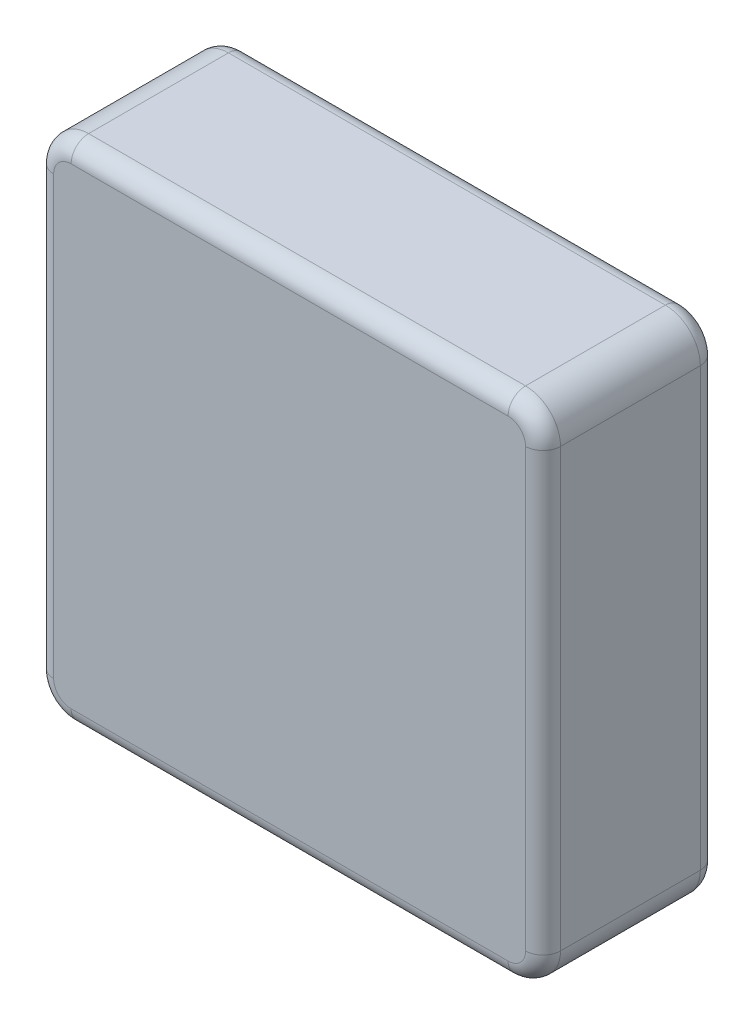
ISO-10303-21;
HEADER;
FILE_DESCRIPTION(('STEP AP214'),'2;1');
FILE_NAME('part.step','',(''),(''),'','','');
FILE_SCHEMA(('AUTOMOTIVE_DESIGN { 1 0 10303 214 1 1 1 1 }'));
ENDSEC;
DATA;
#1=APPLICATION_CONTEXT('core data for automotive mechanical design processes');
#2=APPLICATION_PROTOCOL_DEFINITION('international standard','automotive_design',2000,#1);
#3=PRODUCT_CONTEXT('',#1,'mechanical');
#4=PRODUCT('Part','Part','',(#3));
#5=PRODUCT_RELATED_PRODUCT_CATEGORY('part','',(#4));
#6=PRODUCT_DEFINITION_FORMATION('','',#4);
#7=PRODUCT_DEFINITION_CONTEXT('part definition',#1,'design');
#8=PRODUCT_DEFINITION('design','',#6,#7);
#9=PRODUCT_DEFINITION_SHAPE('','',#8);
#10=(LENGTH_UNIT() NAMED_UNIT(*) SI_UNIT(.MILLI.,.METRE.));
#11=(NAMED_UNIT(*) PLANE_ANGLE_UNIT() SI_UNIT($,.RADIAN.));
#12=(NAMED_UNIT(*) SI_UNIT($,.STERADIAN.) SOLID_ANGLE_UNIT());
#13=UNCERTAINTY_MEASURE_WITH_UNIT(LENGTH_MEASURE(1.E-05),#10,'distance_accuracy_value','');
#14=(GEOMETRIC_REPRESENTATION_CONTEXT(3) GLOBAL_UNCERTAINTY_ASSIGNED_CONTEXT((#13)) GLOBAL_UNIT_ASSIGNED_CONTEXT((#10,
#11,#12)) REPRESENTATION_CONTEXT('',''));
#15=CARTESIAN_POINT('',(0.,0.,0.));
#16=DIRECTION('',(0.,0.,1.));
#17=DIRECTION('',(1.,0.,0.));
#18=AXIS2_PLACEMENT_3D('',#15,#16,#17);
#19=CARTESIAN_POINT('',(-14.5,14.5,10.));
#20=DIRECTION('',(1.,0.,0.));
#21=DIRECTION('',(0.,1.,0.));
#22=AXIS2_PLACEMENT_3D('',#19,#20,#21);
#23=PLANE('',#22);
#24=DIRECTION('',(0.,0.,-1.));
#25=VECTOR('',#24,1.);
#26=CARTESIAN_POINT('',(-14.5,12.5,10.));
#27=LINE('',#26,#25);
#28=CARTESIAN_POINT('',(-14.5,12.5,9.));
#29=VERTEX_POINT('',#28);
#30=CARTESIAN_POINT('',(-14.5,12.5,0.999999999999999));
#31=VERTEX_POINT('',#30);
#32=EDGE_CURVE('E189',#29,#31,#27,.T.);
#33=ORIENTED_EDGE('',*,*,#32,.T.);
#34=DIRECTION('',(0.,-1.,0.));
#35=VECTOR('',#34,1.);
#36=CARTESIAN_POINT('',(-14.5,14.5,0.999999999999999));
#37=LINE('',#36,#35);
#38=CARTESIAN_POINT('',(-14.5,-12.5,0.999999999999999));
#39=VERTEX_POINT('',#38);
#40=EDGE_CURVE('E11',#31,#39,#37,.T.);
#41=ORIENTED_EDGE('',*,*,#40,.T.);
#42=DIRECTION('',(0.,0.,-1.));
#43=VECTOR('',#42,1.);
#44=CARTESIAN_POINT('',(-14.5,-12.5,10.));
#45=LINE('',#44,#43);
#46=CARTESIAN_POINT('',(-14.5,-12.5,9.));
#47=VERTEX_POINT('',#46);
#48=EDGE_CURVE('E192',#39,#47,#45,.F.);
#49=ORIENTED_EDGE('',*,*,#48,.T.);
#50=DIRECTION('',(0.,-1.,0.));
#51=VECTOR('',#50,1.);
#52=CARTESIAN_POINT('',(-14.5,12.5,9.));
#53=LINE('',#52,#51);
#54=EDGE_CURVE('E50',#47,#29,#53,.F.);
#55=ORIENTED_EDGE('',*,*,#54,.T.);
#56=EDGE_LOOP('',(#33,#41,#49,#55));
#57=FACE_BOUND('',#56,.T.);
#58=ADVANCED_FACE('F41',(#57),#23,.F.);
#59=CARTESIAN_POINT('',(-14.5,-14.5,10.));
#60=DIRECTION('',(0.,1.,0.));
#61=DIRECTION('',(0.,0.,1.));
#62=AXIS2_PLACEMENT_3D('',#59,#60,#61);
#63=PLANE('',#62);
#64=DIRECTION('',(0.,0.,-1.));
#65=VECTOR('',#64,1.);
#66=CARTESIAN_POINT('',(12.5,-14.5,10.));
#67=LINE('',#66,#65);
#68=CARTESIAN_POINT('',(12.5,-14.5,0.999999999999999));
#69=VERTEX_POINT('',#68);
#70=CARTESIAN_POINT('',(12.5,-14.5,9.));
#71=VERTEX_POINT('',#70);
#72=EDGE_CURVE('E183',#69,#71,#67,.F.);
#73=ORIENTED_EDGE('',*,*,#72,.T.);
#74=DIRECTION('',(1.,0.,0.));
#75=VECTOR('',#74,1.);
#76=CARTESIAN_POINT('',(-12.5,-14.5,9.));
#77=LINE('',#76,#75);
#78=CARTESIAN_POINT('',(-12.5,-14.5,9.));
#79=VERTEX_POINT('',#78);
#80=EDGE_CURVE('E248',#71,#79,#77,.F.);
#81=ORIENTED_EDGE('',*,*,#80,.T.);
#82=DIRECTION('',(0.,0.,-1.));
#83=VECTOR('',#82,1.);
#84=CARTESIAN_POINT('',(-12.5,-14.5,10.));
#85=LINE('',#84,#83);
#86=CARTESIAN_POINT('',(-12.5,-14.5,0.999999999999999));
#87=VERTEX_POINT('',#86);
#88=EDGE_CURVE('E186',#79,#87,#85,.T.);
#89=ORIENTED_EDGE('',*,*,#88,.T.);
#90=DIRECTION('',(1.,0.,0.));
#91=VECTOR('',#90,1.);
#92=CARTESIAN_POINT('',(-14.5,-14.5,0.999999999999999));
#93=LINE('',#92,#91);
#94=EDGE_CURVE('E246',#87,#69,#93,.T.);
#95=ORIENTED_EDGE('',*,*,#94,.T.);
#96=EDGE_LOOP('',(#73,#81,#89,#95));
#97=FACE_BOUND('',#96,.T.);
#98=ADVANCED_FACE('F327',(#97),#63,.F.);
#99=CARTESIAN_POINT('',(14.5,14.5,10.));
#100=DIRECTION('',(-1.,0.,0.));
#101=DIRECTION('',(0.,-1.,0.));
#102=AXIS2_PLACEMENT_3D('',#99,#100,#101);
#103=PLANE('',#102);
#104=DIRECTION('',(0.,0.,-1.));
#105=VECTOR('',#104,1.);
#106=CARTESIAN_POINT('',(14.5,12.5,10.));
#107=LINE('',#106,#105);
#108=CARTESIAN_POINT('',(14.5,12.5,0.999999999999999));
#109=VERTEX_POINT('',#108);
#110=CARTESIAN_POINT('',(14.5,12.5,9.));
#111=VERTEX_POINT('',#110);
#112=EDGE_CURVE('E195',#109,#111,#107,.F.);
#113=ORIENTED_EDGE('',*,*,#112,.T.);
#114=DIRECTION('',(0.,1.,0.));
#115=VECTOR('',#114,1.);
#116=CARTESIAN_POINT('',(14.5,-12.5,9.));
#117=LINE('',#116,#115);
#118=CARTESIAN_POINT('',(14.5,-12.5,9.));
#119=VERTEX_POINT('',#118);
#120=EDGE_CURVE('E240',#111,#119,#117,.F.);
#121=ORIENTED_EDGE('',*,*,#120,.T.);
#122=DIRECTION('',(0.,0.,-1.));
#123=VECTOR('',#122,1.);
#124=CARTESIAN_POINT('',(14.5,-12.5,10.));
#125=LINE('',#124,#123);
#126=CARTESIAN_POINT('',(14.5,-12.5,0.999999999999999));
#127=VERTEX_POINT('',#126);
#128=EDGE_CURVE('E198',#119,#127,#125,.T.);
#129=ORIENTED_EDGE('',*,*,#128,.T.);
#130=DIRECTION('',(0.,1.,0.));
#131=VECTOR('',#130,1.);
#132=CARTESIAN_POINT('',(14.5,14.5,0.999999999999999));
#133=LINE('',#132,#131);
#134=EDGE_CURVE('E238',#127,#109,#133,.T.);
#135=ORIENTED_EDGE('',*,*,#134,.T.);
#136=EDGE_LOOP('',(#113,#121,#129,#135));
#137=FACE_BOUND('',#136,.T.);
#138=ADVANCED_FACE('F380',(#137),#103,.F.);
#139=CARTESIAN_POINT('',(-14.5,14.5,10.));
#140=DIRECTION('',(0.,-1.,0.));
#141=DIRECTION('',(0.,0.,-1.));
#142=AXIS2_PLACEMENT_3D('',#139,#140,#141);
#143=PLANE('',#142);
#144=DIRECTION('',(0.,0.,-1.));
#145=VECTOR('',#144,1.);
#146=CARTESIAN_POINT('',(-12.5,14.5,10.));
#147=LINE('',#146,#145);
#148=CARTESIAN_POINT('',(-12.5,14.5,0.999999999999999));
#149=VERTEX_POINT('',#148);
#150=CARTESIAN_POINT('',(-12.5,14.5,9.));
#151=VERTEX_POINT('',#150);
#152=EDGE_CURVE('E201',#149,#151,#147,.F.);
#153=ORIENTED_EDGE('',*,*,#152,.T.);
#154=DIRECTION('',(-1.,0.,0.));
#155=VECTOR('',#154,1.);
#156=CARTESIAN_POINT('',(12.5,14.5,9.));
#157=LINE('',#156,#155);
#158=CARTESIAN_POINT('',(12.5,14.5,9.));
#159=VERTEX_POINT('',#158);
#160=EDGE_CURVE('E231',#151,#159,#157,.F.);
#161=ORIENTED_EDGE('',*,*,#160,.T.);
#162=DIRECTION('',(0.,0.,-1.));
#163=VECTOR('',#162,1.);
#164=CARTESIAN_POINT('',(12.5,14.5,10.));
#165=LINE('',#164,#163);
#166=CARTESIAN_POINT('',(12.5,14.5,0.999999999999999));
#167=VERTEX_POINT('',#166);
#168=EDGE_CURVE('E204',#159,#167,#165,.T.);
#169=ORIENTED_EDGE('',*,*,#168,.T.);
#170=DIRECTION('',(-1.,0.,0.));
#171=VECTOR('',#170,1.);
#172=CARTESIAN_POINT('',(-14.5,14.5,0.999999999999999));
#173=LINE('',#172,#171);
#174=EDGE_CURVE('E229',#167,#149,#173,.T.);
#175=ORIENTED_EDGE('',*,*,#174,.T.);
#176=EDGE_LOOP('',(#153,#161,#169,#175));
#177=FACE_BOUND('',#176,.T.);
#178=ADVANCED_FACE('F365',(#177),#143,.F.);
#179=CARTESIAN_POINT('',(0.,0.,10.));
#180=DIRECTION('',(0.,0.,1.));
#181=DIRECTION('',(1.,0.,0.));
#182=AXIS2_PLACEMENT_3D('',#179,#180,#181);
#183=PLANE('',#182);
#184=DIRECTION('',(-1.,0.,0.));
#185=VECTOR('',#184,1.);
#186=CARTESIAN_POINT('',(-12.5,13.5,10.));
#187=LINE('',#186,#185);
#188=CARTESIAN_POINT('',(12.5,13.5,10.));
#189=VERTEX_POINT('',#188);
#190=CARTESIAN_POINT('',(-12.5,13.5,10.));
#191=VERTEX_POINT('',#190);
#192=EDGE_CURVE('E219',#189,#191,#187,.T.);
#193=ORIENTED_EDGE('',*,*,#192,.T.);
#194=CARTESIAN_POINT('',(-12.5,12.5,10.));
#195=DIRECTION('',(0.,0.,1.));
#196=DIRECTION('',(1.,0.,0.));
#197=AXIS2_PLACEMENT_3D('',#194,#195,#196);
#198=CIRCLE('',#197,1.);
#199=CARTESIAN_POINT('',(-13.5,12.5,10.));
#200=VERTEX_POINT('',#199);
#201=EDGE_CURVE('E221',#191,#200,#198,.T.);
#202=ORIENTED_EDGE('',*,*,#201,.T.);
#203=DIRECTION('',(0.,-1.,0.));
#204=VECTOR('',#203,1.);
#205=CARTESIAN_POINT('',(-13.5,-12.5,10.));
#206=LINE('',#205,#204);
#207=CARTESIAN_POINT('',(-13.5,-12.5,10.));
#208=VERTEX_POINT('',#207);
#209=EDGE_CURVE('E207',#200,#208,#206,.T.);
#210=ORIENTED_EDGE('',*,*,#209,.T.);
#211=CARTESIAN_POINT('',(-12.5,-12.5,10.));
#212=DIRECTION('',(0.,0.,1.));
#213=DIRECTION('',(1.,0.,0.));
#214=AXIS2_PLACEMENT_3D('',#211,#212,#213);
#215=CIRCLE('',#214,1.);
#216=CARTESIAN_POINT('',(-12.5,-13.5,10.));
#217=VERTEX_POINT('',#216);
#218=EDGE_CURVE('E209',#208,#217,#215,.T.);
#219=ORIENTED_EDGE('',*,*,#218,.T.);
#220=DIRECTION('',(1.,0.,0.));
#221=VECTOR('',#220,1.);
#222=CARTESIAN_POINT('',(12.5,-13.5,10.));
#223=LINE('',#222,#221);
#224=CARTESIAN_POINT('',(12.5,-13.5,10.));
#225=VERTEX_POINT('',#224);
#226=EDGE_CURVE('E211',#217,#225,#223,.T.);
#227=ORIENTED_EDGE('',*,*,#226,.T.);
#228=CARTESIAN_POINT('',(12.5,-12.5,10.));
#229=DIRECTION('',(0.,0.,1.));
#230=DIRECTION('',(1.,0.,0.));
#231=AXIS2_PLACEMENT_3D('',#228,#229,#230);
#232=CIRCLE('',#231,1.);
#233=CARTESIAN_POINT('',(13.5,-12.5,10.));
#234=VERTEX_POINT('',#233);
#235=EDGE_CURVE('E213',#225,#234,#232,.T.);
#236=ORIENTED_EDGE('',*,*,#235,.T.);
#237=DIRECTION('',(0.,1.,0.));
#238=VECTOR('',#237,1.);
#239=CARTESIAN_POINT('',(13.5,12.5,10.));
#240=LINE('',#239,#238);
#241=CARTESIAN_POINT('',(13.5,12.5,10.));
#242=VERTEX_POINT('',#241);
#243=EDGE_CURVE('E215',#234,#242,#240,.T.);
#244=ORIENTED_EDGE('',*,*,#243,.T.);
#245=CARTESIAN_POINT('',(12.5,12.5,10.));
#246=DIRECTION('',(0.,0.,1.));
#247=DIRECTION('',(1.,0.,0.));
#248=AXIS2_PLACEMENT_3D('',#245,#246,#247);
#249=CIRCLE('',#248,1.);
#250=EDGE_CURVE('E217',#242,#189,#249,.T.);
#251=ORIENTED_EDGE('',*,*,#250,.T.);
#252=EDGE_LOOP('',(#193,#202,#210,#219,#227,#236,#244,#251));
#253=FACE_BOUND('',#252,.T.);
#254=ADVANCED_FACE('F357',(#253),#183,.T.);
#255=CARTESIAN_POINT('',(0.,0.,0.));
#256=DIRECTION('',(0.,0.,1.));
#257=DIRECTION('',(1.,0.,0.));
#258=AXIS2_PLACEMENT_3D('',#255,#256,#257);
#259=PLANE('',#258);
#260=DIRECTION('',(-1.,0.,0.));
#261=VECTOR('',#260,1.);
#262=CARTESIAN_POINT('',(0.,13.5,0.));
#263=LINE('',#262,#261);
#264=CARTESIAN_POINT('',(-12.5,13.5,0.));
#265=VERTEX_POINT('',#264);
#266=CARTESIAN_POINT('',(12.5,13.5,0.));
#267=VERTEX_POINT('',#266);
#268=EDGE_CURVE('E254',#265,#267,#263,.F.);
#269=ORIENTED_EDGE('',*,*,#268,.T.);
#270=CARTESIAN_POINT('',(12.5,12.5,0.));
#271=DIRECTION('',(0.,0.,1.));
#272=DIRECTION('',(1.,0.,0.));
#273=AXIS2_PLACEMENT_3D('',#270,#271,#272);
#274=CIRCLE('',#273,1.);
#275=CARTESIAN_POINT('',(13.5,12.5,0.));
#276=VERTEX_POINT('',#275);
#277=EDGE_CURVE('E267',#267,#276,#274,.F.);
#278=ORIENTED_EDGE('',*,*,#277,.T.);
#279=DIRECTION('',(0.,1.,0.));
#280=VECTOR('',#279,1.);
#281=CARTESIAN_POINT('',(13.5,0.,0.));
#282=LINE('',#281,#280);
#283=CARTESIAN_POINT('',(13.5,-12.5,0.));
#284=VERTEX_POINT('',#283);
#285=EDGE_CURVE('E65',#276,#284,#282,.F.);
#286=ORIENTED_EDGE('',*,*,#285,.T.);
#287=CARTESIAN_POINT('',(12.5,-12.5,0.));
#288=DIRECTION('',(0.,0.,1.));
#289=DIRECTION('',(1.,0.,0.));
#290=AXIS2_PLACEMENT_3D('',#287,#288,#289);
#291=CIRCLE('',#290,1.);
#292=CARTESIAN_POINT('',(12.5,-13.5,0.));
#293=VERTEX_POINT('',#292);
#294=EDGE_CURVE('E264',#284,#293,#291,.F.);
#295=ORIENTED_EDGE('',*,*,#294,.T.);
#296=DIRECTION('',(1.,0.,0.));
#297=VECTOR('',#296,1.);
#298=CARTESIAN_POINT('',(0.,-13.5,0.));
#299=LINE('',#298,#297);
#300=CARTESIAN_POINT('',(-12.5,-13.5,0.));
#301=VERTEX_POINT('',#300);
#302=EDGE_CURVE('E262',#293,#301,#299,.F.);
#303=ORIENTED_EDGE('',*,*,#302,.T.);
#304=CARTESIAN_POINT('',(-12.5,-12.5,0.));
#305=DIRECTION('',(0.,0.,1.));
#306=DIRECTION('',(1.,0.,0.));
#307=AXIS2_PLACEMENT_3D('',#304,#305,#306);
#308=CIRCLE('',#307,1.);
#309=CARTESIAN_POINT('',(-13.5,-12.5,0.));
#310=VERTEX_POINT('',#309);
#311=EDGE_CURVE('E260',#301,#310,#308,.F.);
#312=ORIENTED_EDGE('',*,*,#311,.T.);
#313=DIRECTION('',(0.,-1.,0.));
#314=VECTOR('',#313,1.);
#315=CARTESIAN_POINT('',(-13.5,0.,0.));
#316=LINE('',#315,#314);
#317=CARTESIAN_POINT('',(-13.5,12.5,0.));
#318=VERTEX_POINT('',#317);
#319=EDGE_CURVE('E258',#310,#318,#316,.F.);
#320=ORIENTED_EDGE('',*,*,#319,.T.);
#321=CARTESIAN_POINT('',(-12.5,12.5,0.));
#322=DIRECTION('',(0.,0.,1.));
#323=DIRECTION('',(1.,0.,0.));
#324=AXIS2_PLACEMENT_3D('',#321,#322,#323);
#325=CIRCLE('',#324,1.);
#326=EDGE_CURVE('E256',#318,#265,#325,.F.);
#327=ORIENTED_EDGE('',*,*,#326,.T.);
#328=EDGE_LOOP('',(#269,#278,#286,#295,#303,#312,#320,#327));
#329=FACE_BOUND('',#328,.T.);
#330=CARTESIAN_POINT('',(11.,11.,0.));
#331=DIRECTION('',(0.,0.,-1.));
#332=DIRECTION('',(-1.,0.,0.));
#333=AXIS2_PLACEMENT_3D('',#330,#331,#332);
#334=CIRCLE('',#333,1.25);
#335=CARTESIAN_POINT('',(9.75,11.,0.));
#336=VERTEX_POINT('',#335);
#337=EDGE_CURVE('E172',#336,#336,#334,.T.);
#338=ORIENTED_EDGE('',*,*,#337,.F.);
#339=EDGE_LOOP('',(#338));
#340=FACE_BOUND('',#339,.T.);
#341=CARTESIAN_POINT('',(-11.,-11.,0.));
#342=DIRECTION('',(0.,0.,-1.));
#343=DIRECTION('',(-1.,0.,0.));
#344=AXIS2_PLACEMENT_3D('',#341,#342,#343);
#345=CIRCLE('',#344,1.25);
#346=CARTESIAN_POINT('',(-12.25,-11.,0.));
#347=VERTEX_POINT('',#346);
#348=EDGE_CURVE('E171',#347,#347,#345,.T.);
#349=ORIENTED_EDGE('',*,*,#348,.F.);
#350=EDGE_LOOP('',(#349));
#351=FACE_BOUND('',#350,.T.);
#352=ADVANCED_FACE('F606',(#329,#340,#351),#259,.F.);
#353=CARTESIAN_POINT('',(-11.,-11.,8.5));
#354=DIRECTION('',(0.,0.,-1.));
#355=DIRECTION('',(-1.,0.,0.));
#356=AXIS2_PLACEMENT_3D('',#353,#354,#355);
#357=CONICAL_SURFACE('',#356,1.25,1.02974425867665);
#358=CARTESIAN_POINT('',(-11.,-11.,9.25107577378445));
#359=VERTEX_POINT('',#358);
#360=VERTEX_LOOP('',#359);
#361=FACE_BOUND('',#360,.T.);
#362=CARTESIAN_POINT('',(-11.,-11.,8.5));
#363=DIRECTION('',(0.,0.,-1.));
#364=DIRECTION('',(-1.,0.,0.));
#365=AXIS2_PLACEMENT_3D('',#362,#363,#364);
#366=CIRCLE('',#365,1.25);
#367=CARTESIAN_POINT('',(-12.25,-11.,8.5));
#368=VERTEX_POINT('',#367);
#369=EDGE_CURVE('E175',#368,#368,#366,.T.);
#370=ORIENTED_EDGE('',*,*,#369,.T.);
#371=EDGE_LOOP('',(#370));
#372=FACE_BOUND('',#371,.T.);
#373=ADVANCED_FACE('F596',(#361,#372),#357,.F.);
#374=CARTESIAN_POINT('',(-11.,-11.,0.));
#375=DIRECTION('',(0.,0.,-1.));
#376=DIRECTION('',(-1.,0.,0.));
#377=AXIS2_PLACEMENT_3D('',#374,#375,#376);
#378=CYLINDRICAL_SURFACE('',#377,1.25);
#379=ORIENTED_EDGE('',*,*,#369,.F.);
#380=EDGE_LOOP('',(#379));
#381=FACE_BOUND('',#380,.T.);
#382=ORIENTED_EDGE('',*,*,#348,.T.);
#383=EDGE_LOOP('',(#382));
#384=FACE_BOUND('',#383,.T.);
#385=ADVANCED_FACE('F165',(#381,#384),#378,.F.);
#386=CARTESIAN_POINT('',(11.,11.,8.5));
#387=DIRECTION('',(0.,0.,-1.));
#388=DIRECTION('',(-1.,0.,0.));
#389=AXIS2_PLACEMENT_3D('',#386,#387,#388);
#390=CONICAL_SURFACE('',#389,1.25,1.02974425867665);
#391=CARTESIAN_POINT('',(11.,11.,9.25107577378445));
#392=VERTEX_POINT('',#391);
#393=VERTEX_LOOP('',#392);
#394=FACE_BOUND('',#393,.T.);
#395=CARTESIAN_POINT('',(11.,11.,8.5));
#396=DIRECTION('',(0.,0.,-1.));
#397=DIRECTION('',(-1.,0.,0.));
#398=AXIS2_PLACEMENT_3D('',#395,#396,#397);
#399=CIRCLE('',#398,1.25);
#400=CARTESIAN_POINT('',(9.75,11.,8.5));
#401=VERTEX_POINT('',#400);
#402=EDGE_CURVE('E169',#401,#401,#399,.T.);
#403=ORIENTED_EDGE('',*,*,#402,.T.);
#404=EDGE_LOOP('',(#403));
#405=FACE_BOUND('',#404,.T.);
#406=ADVANCED_FACE('F161',(#394,#405),#390,.F.);
#407=CARTESIAN_POINT('',(11.,11.,0.));
#408=DIRECTION('',(0.,0.,-1.));
#409=DIRECTION('',(-1.,0.,0.));
#410=AXIS2_PLACEMENT_3D('',#407,#408,#409);
#411=CYLINDRICAL_SURFACE('',#410,1.25);
#412=ORIENTED_EDGE('',*,*,#402,.F.);
#413=EDGE_LOOP('',(#412));
#414=FACE_BOUND('',#413,.T.);
#415=ORIENTED_EDGE('',*,*,#337,.T.);
#416=EDGE_LOOP('',(#415));
#417=FACE_BOUND('',#416,.T.);
#418=ADVANCED_FACE('F164',(#414,#417),#411,.F.);
#419=CARTESIAN_POINT('',(-12.5,-12.5,10.));
#420=DIRECTION('',(0.,0.,-1.));
#421=DIRECTION('',(-1.,0.,0.));
#422=AXIS2_PLACEMENT_3D('',#419,#420,#421);
#423=CYLINDRICAL_SURFACE('',#422,2.);
#424=ORIENTED_EDGE('',*,*,#88,.F.);
#425=CARTESIAN_POINT('',(-12.5,-12.5,9.));
#426=DIRECTION('',(0.,0.,1.));
#427=DIRECTION('',(1.,0.,0.));
#428=AXIS2_PLACEMENT_3D('',#425,#426,#427);
#429=CIRCLE('',#428,2.);
#430=EDGE_CURVE('E252',#79,#47,#429,.F.);
#431=ORIENTED_EDGE('',*,*,#430,.T.);
#432=ORIENTED_EDGE('',*,*,#48,.F.);
#433=CARTESIAN_POINT('',(-12.5,-12.5,0.999999999999999));
#434=DIRECTION('',(0.,0.,1.));
#435=DIRECTION('',(1.,0.,0.));
#436=AXIS2_PLACEMENT_3D('',#433,#434,#435);
#437=CIRCLE('',#436,2.);
#438=EDGE_CURVE('E250',#39,#87,#437,.T.);
#439=ORIENTED_EDGE('',*,*,#438,.T.);
#440=EDGE_LOOP('',(#424,#431,#432,#439));
#441=FACE_BOUND('',#440,.T.);
#442=ADVANCED_FACE('F324',(#441),#423,.T.);
#443=CARTESIAN_POINT('',(12.5,-12.5,10.));
#444=DIRECTION('',(0.,0.,-1.));
#445=DIRECTION('',(-1.,0.,0.));
#446=AXIS2_PLACEMENT_3D('',#443,#444,#445);
#447=CYLINDRICAL_SURFACE('',#446,2.);
#448=ORIENTED_EDGE('',*,*,#128,.F.);
#449=CARTESIAN_POINT('',(12.5,-12.5,9.));
#450=DIRECTION('',(0.,0.,1.));
#451=DIRECTION('',(1.,0.,0.));
#452=AXIS2_PLACEMENT_3D('',#449,#450,#451);
#453=CIRCLE('',#452,2.);
#454=EDGE_CURVE('E244',#119,#71,#453,.F.);
#455=ORIENTED_EDGE('',*,*,#454,.T.);
#456=ORIENTED_EDGE('',*,*,#72,.F.);
#457=CARTESIAN_POINT('',(12.5,-12.5,0.999999999999999));
#458=DIRECTION('',(0.,0.,1.));
#459=DIRECTION('',(1.,0.,0.));
#460=AXIS2_PLACEMENT_3D('',#457,#458,#459);
#461=CIRCLE('',#460,2.);
#462=EDGE_CURVE('E242',#69,#127,#461,.T.);
#463=ORIENTED_EDGE('',*,*,#462,.T.);
#464=EDGE_LOOP('',(#448,#455,#456,#463));
#465=FACE_BOUND('',#464,.T.);
#466=ADVANCED_FACE('F384',(#465),#447,.T.);
#467=CARTESIAN_POINT('',(12.5,12.5,10.));
#468=DIRECTION('',(0.,0.,-1.));
#469=DIRECTION('',(-1.,0.,0.));
#470=AXIS2_PLACEMENT_3D('',#467,#468,#469);
#471=CYLINDRICAL_SURFACE('',#470,2.);
#472=ORIENTED_EDGE('',*,*,#168,.F.);
#473=CARTESIAN_POINT('',(12.5,12.5,9.));
#474=DIRECTION('',(0.,0.,1.));
#475=DIRECTION('',(1.,0.,0.));
#476=AXIS2_PLACEMENT_3D('',#473,#474,#475);
#477=CIRCLE('',#476,2.);
#478=EDGE_CURVE('E236',#159,#111,#477,.F.);
#479=ORIENTED_EDGE('',*,*,#478,.T.);
#480=ORIENTED_EDGE('',*,*,#112,.F.);
#481=CARTESIAN_POINT('',(12.5,12.5,0.999999999999999));
#482=DIRECTION('',(0.,0.,1.));
#483=DIRECTION('',(1.,0.,0.));
#484=AXIS2_PLACEMENT_3D('',#481,#482,#483);
#485=CIRCLE('',#484,2.);
#486=EDGE_CURVE('E233',#109,#167,#485,.T.);
#487=ORIENTED_EDGE('',*,*,#486,.T.);
#488=EDGE_LOOP('',(#472,#479,#480,#487));
#489=FACE_BOUND('',#488,.T.);
#490=ADVANCED_FACE('F368',(#489),#471,.T.);
#491=CARTESIAN_POINT('',(-12.5,12.5,10.));
#492=DIRECTION('',(0.,0.,-1.));
#493=DIRECTION('',(-1.,0.,0.));
#494=AXIS2_PLACEMENT_3D('',#491,#492,#493);
#495=CYLINDRICAL_SURFACE('',#494,2.);
#496=ORIENTED_EDGE('',*,*,#32,.F.);
#497=CARTESIAN_POINT('',(-12.5,12.5,9.));
#498=DIRECTION('',(0.,0.,1.));
#499=DIRECTION('',(1.,0.,0.));
#500=AXIS2_PLACEMENT_3D('',#497,#498,#499);
#501=CIRCLE('',#500,2.);
#502=EDGE_CURVE('E226',#29,#151,#501,.F.);
#503=ORIENTED_EDGE('',*,*,#502,.T.);
#504=ORIENTED_EDGE('',*,*,#152,.F.);
#505=CARTESIAN_POINT('',(-12.5,12.5,0.999999999999999));
#506=DIRECTION('',(0.,0.,1.));
#507=DIRECTION('',(1.,0.,0.));
#508=AXIS2_PLACEMENT_3D('',#505,#506,#507);
#509=CIRCLE('',#508,2.);
#510=EDGE_CURVE('E224',#149,#31,#509,.T.);
#511=ORIENTED_EDGE('',*,*,#510,.T.);
#512=EDGE_LOOP('',(#496,#503,#504,#511));
#513=FACE_BOUND('',#512,.T.);
#514=ADVANCED_FACE('F344',(#513),#495,.T.);
#515=CARTESIAN_POINT('',(12.5,-12.5,9.));
#516=DIRECTION('',(0.,0.,1.));
#517=DIRECTION('',(1.,0.,0.));
#518=AXIS2_PLACEMENT_3D('',#515,#516,#517);
#519=DEGENERATE_TOROIDAL_SURFACE('',#518,1.,1.,.T.);
#520=CARTESIAN_POINT('',(12.5,-13.5,9.));
#521=DIRECTION('',(-1.,0.,0.));
#522=DIRECTION('',(0.,-1.,0.));
#523=AXIS2_PLACEMENT_3D('',#520,#521,#522);
#524=CIRCLE('',#523,1.);
#525=EDGE_CURVE('E286',#71,#225,#524,.T.);
#526=ORIENTED_EDGE('',*,*,#525,.F.);
#527=ORIENTED_EDGE('',*,*,#454,.F.);
#528=CARTESIAN_POINT('',(13.5,-12.5,9.));
#529=DIRECTION('',(0.,1.,0.));
#530=DIRECTION('',(0.,0.,1.));
#531=AXIS2_PLACEMENT_3D('',#528,#529,#530);
#532=CIRCLE('',#531,1.);
#533=EDGE_CURVE('E178',#234,#119,#532,.T.);
#534=ORIENTED_EDGE('',*,*,#533,.F.);
#535=ORIENTED_EDGE('',*,*,#235,.F.);
#536=EDGE_LOOP('',(#526,#527,#534,#535));
#537=FACE_BOUND('',#536,.T.);
#538=ADVANCED_FACE('F387',(#537),#519,.T.);
#539=CARTESIAN_POINT('',(13.5,0.,9.));
#540=DIRECTION('',(0.,-1.,0.));
#541=DIRECTION('',(1.,0.,0.));
#542=AXIS2_PLACEMENT_3D('',#539,#540,#541);
#543=CYLINDRICAL_SURFACE('',#542,1.);
#544=ORIENTED_EDGE('',*,*,#533,.T.);
#545=ORIENTED_EDGE('',*,*,#120,.F.);
#546=CARTESIAN_POINT('',(13.5,12.5,9.));
#547=DIRECTION('',(0.,1.,0.));
#548=DIRECTION('',(0.,0.,1.));
#549=AXIS2_PLACEMENT_3D('',#546,#547,#548);
#550=CIRCLE('',#549,1.);
#551=EDGE_CURVE('E283',#242,#111,#550,.T.);
#552=ORIENTED_EDGE('',*,*,#551,.F.);
#553=ORIENTED_EDGE('',*,*,#243,.F.);
#554=EDGE_LOOP('',(#544,#545,#552,#553));
#555=FACE_BOUND('',#554,.T.);
#556=ADVANCED_FACE('F376',(#555),#543,.T.);
#557=CARTESIAN_POINT('',(0.,-13.5,9.));
#558=DIRECTION('',(-1.,0.,0.));
#559=DIRECTION('',(0.,0.,1.));
#560=AXIS2_PLACEMENT_3D('',#557,#558,#559);
#561=CYLINDRICAL_SURFACE('',#560,1.);
#562=ORIENTED_EDGE('',*,*,#525,.T.);
#563=ORIENTED_EDGE('',*,*,#226,.F.);
#564=CARTESIAN_POINT('',(-12.5,-13.5,9.));
#565=DIRECTION('',(-1.,0.,0.));
#566=DIRECTION('',(0.,0.,1.));
#567=AXIS2_PLACEMENT_3D('',#564,#565,#566);
#568=CIRCLE('',#567,1.);
#569=EDGE_CURVE('E280',#79,#217,#568,.T.);
#570=ORIENTED_EDGE('',*,*,#569,.F.);
#571=ORIENTED_EDGE('',*,*,#80,.F.);
#572=EDGE_LOOP('',(#562,#563,#570,#571));
#573=FACE_BOUND('',#572,.T.);
#574=ADVANCED_FACE('F332',(#573),#561,.T.);
#575=CARTESIAN_POINT('',(12.5,12.5,9.));
#576=DIRECTION('',(0.,0.,1.));
#577=DIRECTION('',(1.,0.,0.));
#578=AXIS2_PLACEMENT_3D('',#575,#576,#577);
#579=DEGENERATE_TOROIDAL_SURFACE('',#578,1.,1.,.T.);
#580=ORIENTED_EDGE('',*,*,#551,.T.);
#581=ORIENTED_EDGE('',*,*,#478,.F.);
#582=CARTESIAN_POINT('',(12.5,13.5,9.));
#583=DIRECTION('',(-1.,0.,0.));
#584=DIRECTION('',(0.,0.,1.));
#585=AXIS2_PLACEMENT_3D('',#582,#583,#584);
#586=CIRCLE('',#585,1.);
#587=EDGE_CURVE('E277',#189,#159,#586,.T.);
#588=ORIENTED_EDGE('',*,*,#587,.F.);
#589=ORIENTED_EDGE('',*,*,#250,.F.);
#590=EDGE_LOOP('',(#580,#581,#588,#589));
#591=FACE_BOUND('',#590,.T.);
#592=ADVANCED_FACE('F371',(#591),#579,.T.);
#593=CARTESIAN_POINT('',(-12.5,-12.5,9.));
#594=DIRECTION('',(0.,0.,1.));
#595=DIRECTION('',(1.,0.,0.));
#596=AXIS2_PLACEMENT_3D('',#593,#594,#595);
#597=DEGENERATE_TOROIDAL_SURFACE('',#596,1.,1.,.T.);
#598=ORIENTED_EDGE('',*,*,#569,.T.);
#599=ORIENTED_EDGE('',*,*,#218,.F.);
#600=CARTESIAN_POINT('',(-13.5,-12.5,9.));
#601=DIRECTION('',(0.,1.,0.));
#602=DIRECTION('',(-1.,0.,0.));
#603=AXIS2_PLACEMENT_3D('',#600,#601,#602);
#604=CIRCLE('',#603,1.);
#605=EDGE_CURVE('E274',#47,#208,#604,.T.);
#606=ORIENTED_EDGE('',*,*,#605,.F.);
#607=ORIENTED_EDGE('',*,*,#430,.F.);
#608=EDGE_LOOP('',(#598,#599,#606,#607));
#609=FACE_BOUND('',#608,.T.);
#610=ADVANCED_FACE('F338',(#609),#597,.T.);
#611=CARTESIAN_POINT('',(0.,13.5,9.));
#612=DIRECTION('',(1.,0.,0.));
#613=DIRECTION('',(0.,0.,-1.));
#614=AXIS2_PLACEMENT_3D('',#611,#612,#613);
#615=CYLINDRICAL_SURFACE('',#614,1.);
#616=ORIENTED_EDGE('',*,*,#587,.T.);
#617=ORIENTED_EDGE('',*,*,#160,.F.);
#618=CARTESIAN_POINT('',(-12.5,13.5,9.));
#619=DIRECTION('',(-1.,0.,0.));
#620=DIRECTION('',(0.,0.,1.));
#621=AXIS2_PLACEMENT_3D('',#618,#619,#620);
#622=CIRCLE('',#621,1.);
#623=EDGE_CURVE('E272',#191,#151,#622,.T.);
#624=ORIENTED_EDGE('',*,*,#623,.F.);
#625=ORIENTED_EDGE('',*,*,#192,.F.);
#626=EDGE_LOOP('',(#616,#617,#624,#625));
#627=FACE_BOUND('',#626,.T.);
#628=ADVANCED_FACE('F362',(#627),#615,.T.);
#629=CARTESIAN_POINT('',(-13.5,0.,9.));
#630=DIRECTION('',(0.,1.,0.));
#631=DIRECTION('',(-1.,0.,0.));
#632=AXIS2_PLACEMENT_3D('',#629,#630,#631);
#633=CYLINDRICAL_SURFACE('',#632,1.);
#634=ORIENTED_EDGE('',*,*,#605,.T.);
#635=ORIENTED_EDGE('',*,*,#209,.F.);
#636=CARTESIAN_POINT('',(-13.5,12.5,9.));
#637=DIRECTION('',(0.,1.,0.));
#638=DIRECTION('',(0.,0.,1.));
#639=AXIS2_PLACEMENT_3D('',#636,#637,#638);
#640=CIRCLE('',#639,1.);
#641=EDGE_CURVE('E270',#29,#200,#640,.T.);
#642=ORIENTED_EDGE('',*,*,#641,.F.);
#643=ORIENTED_EDGE('',*,*,#54,.F.);
#644=EDGE_LOOP('',(#634,#635,#642,#643));
#645=FACE_BOUND('',#644,.T.);
#646=ADVANCED_FACE('F355',(#645),#633,.T.);
#647=CARTESIAN_POINT('',(-12.5,12.5,9.));
#648=DIRECTION('',(0.,0.,1.));
#649=DIRECTION('',(1.,0.,0.));
#650=AXIS2_PLACEMENT_3D('',#647,#648,#649);
#651=DEGENERATE_TOROIDAL_SURFACE('',#650,1.,1.,.T.);
#652=ORIENTED_EDGE('',*,*,#623,.T.);
#653=ORIENTED_EDGE('',*,*,#502,.F.);
#654=ORIENTED_EDGE('',*,*,#641,.T.);
#655=ORIENTED_EDGE('',*,*,#201,.F.);
#656=EDGE_LOOP('',(#652,#653,#654,#655));
#657=FACE_BOUND('',#656,.T.);
#658=ADVANCED_FACE('F349',(#657),#651,.T.);
#659=CARTESIAN_POINT('',(-12.5,-12.5,0.999999999999999));
#660=DIRECTION('',(0.,0.,1.));
#661=DIRECTION('',(1.,0.,0.));
#662=AXIS2_PLACEMENT_3D('',#659,#660,#661);
#663=DEGENERATE_TOROIDAL_SURFACE('',#662,1.,1.,.T.);
#664=CARTESIAN_POINT('',(-12.5,-13.5,0.999999999999999));
#665=DIRECTION('',(1.,0.,0.));
#666=DIRECTION('',(0.,0.,-1.));
#667=AXIS2_PLACEMENT_3D('',#664,#665,#666);
#668=CIRCLE('',#667,1.);
#669=EDGE_CURVE('E305',#87,#301,#668,.T.);
#670=ORIENTED_EDGE('',*,*,#669,.F.);
#671=ORIENTED_EDGE('',*,*,#438,.F.);
#672=CARTESIAN_POINT('',(-13.5,-12.5,1.));
#673=DIRECTION('',(0.,1.,0.));
#674=DIRECTION('',(-1.,0.,0.));
#675=AXIS2_PLACEMENT_3D('',#672,#673,#674);
#676=CIRCLE('',#675,1.);
#677=EDGE_CURVE('E45',#310,#39,#676,.T.);
#678=ORIENTED_EDGE('',*,*,#677,.F.);
#679=ORIENTED_EDGE('',*,*,#311,.F.);
#680=EDGE_LOOP('',(#670,#671,#678,#679));
#681=FACE_BOUND('',#680,.T.);
#682=ADVANCED_FACE('F43',(#681),#663,.T.);
#683=CARTESIAN_POINT('',(-13.5,14.5,0.999999999999999));
#684=DIRECTION('',(0.,-1.,0.));
#685=DIRECTION('',(1.,0.,0.));
#686=AXIS2_PLACEMENT_3D('',#683,#684,#685);
#687=CYLINDRICAL_SURFACE('',#686,1.);
#688=ORIENTED_EDGE('',*,*,#677,.T.);
#689=ORIENTED_EDGE('',*,*,#40,.F.);
#690=CARTESIAN_POINT('',(-13.5,12.5,1.));
#691=DIRECTION('',(0.,1.,0.));
#692=DIRECTION('',(0.,0.,1.));
#693=AXIS2_PLACEMENT_3D('',#690,#691,#692);
#694=CIRCLE('',#693,1.);
#695=EDGE_CURVE('E303',#318,#31,#694,.T.);
#696=ORIENTED_EDGE('',*,*,#695,.F.);
#697=ORIENTED_EDGE('',*,*,#319,.F.);
#698=EDGE_LOOP('',(#688,#689,#696,#697));
#699=FACE_BOUND('',#698,.T.);
#700=ADVANCED_FACE('F316',(#699),#687,.T.);
#701=CARTESIAN_POINT('',(-14.5,-13.5,0.999999999999999));
#702=DIRECTION('',(1.,0.,0.));
#703=DIRECTION('',(0.,0.,-1.));
#704=AXIS2_PLACEMENT_3D('',#701,#702,#703);
#705=CYLINDRICAL_SURFACE('',#704,1.);
#706=ORIENTED_EDGE('',*,*,#669,.T.);
#707=ORIENTED_EDGE('',*,*,#302,.F.);
#708=CARTESIAN_POINT('',(12.5,-13.5,0.999999999999999));
#709=DIRECTION('',(1.,0.,0.));
#710=DIRECTION('',(0.,0.,-1.));
#711=AXIS2_PLACEMENT_3D('',#708,#709,#710);
#712=CIRCLE('',#711,1.);
#713=EDGE_CURVE('E300',#69,#293,#712,.T.);
#714=ORIENTED_EDGE('',*,*,#713,.F.);
#715=ORIENTED_EDGE('',*,*,#94,.F.);
#716=EDGE_LOOP('',(#706,#707,#714,#715));
#717=FACE_BOUND('',#716,.T.);
#718=ADVANCED_FACE('F458',(#717),#705,.T.);
#719=CARTESIAN_POINT('',(-12.5,12.5,0.999999999999999));
#720=DIRECTION('',(0.,0.,1.));
#721=DIRECTION('',(1.,0.,0.));
#722=AXIS2_PLACEMENT_3D('',#719,#720,#721);
#723=DEGENERATE_TOROIDAL_SURFACE('',#722,1.,1.,.T.);
#724=ORIENTED_EDGE('',*,*,#695,.T.);
#725=ORIENTED_EDGE('',*,*,#510,.F.);
#726=CARTESIAN_POINT('',(-12.5,13.5,1.));
#727=DIRECTION('',(1.,0.,0.));
#728=DIRECTION('',(0.,0.,-1.));
#729=AXIS2_PLACEMENT_3D('',#726,#727,#728);
#730=CIRCLE('',#729,1.);
#731=EDGE_CURVE('E297',#265,#149,#730,.T.);
#732=ORIENTED_EDGE('',*,*,#731,.F.);
#733=ORIENTED_EDGE('',*,*,#326,.F.);
#734=EDGE_LOOP('',(#724,#725,#732,#733));
#735=FACE_BOUND('',#734,.T.);
#736=ADVANCED_FACE('F464',(#735),#723,.T.);
#737=CARTESIAN_POINT('',(12.5,-12.5,0.999999999999999));
#738=DIRECTION('',(0.,0.,1.));
#739=DIRECTION('',(1.,0.,0.));
#740=AXIS2_PLACEMENT_3D('',#737,#738,#739);
#741=DEGENERATE_TOROIDAL_SURFACE('',#740,1.,1.,.T.);
#742=ORIENTED_EDGE('',*,*,#713,.T.);
#743=ORIENTED_EDGE('',*,*,#294,.F.);
#744=CARTESIAN_POINT('',(13.5,-12.5,0.999999999999999));
#745=DIRECTION('',(0.,1.,0.));
#746=DIRECTION('',(0.,0.,1.));
#747=AXIS2_PLACEMENT_3D('',#744,#745,#746);
#748=CIRCLE('',#747,1.);
#749=EDGE_CURVE('E294',#127,#284,#748,.T.);
#750=ORIENTED_EDGE('',*,*,#749,.F.);
#751=ORIENTED_EDGE('',*,*,#462,.F.);
#752=EDGE_LOOP('',(#742,#743,#750,#751));
#753=FACE_BOUND('',#752,.T.);
#754=ADVANCED_FACE('F471',(#753),#741,.T.);
#755=CARTESIAN_POINT('',(-14.5,13.5,0.999999999999999));
#756=DIRECTION('',(-1.,0.,0.));
#757=DIRECTION('',(0.,0.,1.));
#758=AXIS2_PLACEMENT_3D('',#755,#756,#757);
#759=CYLINDRICAL_SURFACE('',#758,1.);
#760=ORIENTED_EDGE('',*,*,#731,.T.);
#761=ORIENTED_EDGE('',*,*,#174,.F.);
#762=CARTESIAN_POINT('',(12.5,13.5,1.));
#763=DIRECTION('',(1.,0.,0.));
#764=DIRECTION('',(0.,0.,-1.));
#765=AXIS2_PLACEMENT_3D('',#762,#763,#764);
#766=CIRCLE('',#765,1.);
#767=EDGE_CURVE('E292',#267,#167,#766,.T.);
#768=ORIENTED_EDGE('',*,*,#767,.F.);
#769=ORIENTED_EDGE('',*,*,#268,.F.);
#770=EDGE_LOOP('',(#760,#761,#768,#769));
#771=FACE_BOUND('',#770,.T.);
#772=ADVANCED_FACE('F479',(#771),#759,.T.);
#773=CARTESIAN_POINT('',(13.5,14.5,0.999999999999999));
#774=DIRECTION('',(0.,1.,0.));
#775=DIRECTION('',(-1.,0.,0.));
#776=AXIS2_PLACEMENT_3D('',#773,#774,#775);
#777=CYLINDRICAL_SURFACE('',#776,1.);
#778=ORIENTED_EDGE('',*,*,#749,.T.);
#779=ORIENTED_EDGE('',*,*,#285,.F.);
#780=CARTESIAN_POINT('',(13.5,12.5,0.999999999999999));
#781=DIRECTION('',(0.,1.,0.));
#782=DIRECTION('',(0.,0.,1.));
#783=AXIS2_PLACEMENT_3D('',#780,#781,#782);
#784=CIRCLE('',#783,1.);
#785=EDGE_CURVE('E58',#109,#276,#784,.T.);
#786=ORIENTED_EDGE('',*,*,#785,.F.);
#787=ORIENTED_EDGE('',*,*,#134,.F.);
#788=EDGE_LOOP('',(#778,#779,#786,#787));
#789=FACE_BOUND('',#788,.T.);
#790=ADVANCED_FACE('F487',(#789),#777,.T.);
#791=CARTESIAN_POINT('',(12.5,12.5,0.999999999999999));
#792=DIRECTION('',(0.,0.,1.));
#793=DIRECTION('',(1.,0.,0.));
#794=AXIS2_PLACEMENT_3D('',#791,#792,#793);
#795=DEGENERATE_TOROIDAL_SURFACE('',#794,1.,1.,.T.);
#796=ORIENTED_EDGE('',*,*,#767,.T.);
#797=ORIENTED_EDGE('',*,*,#486,.F.);
#798=ORIENTED_EDGE('',*,*,#785,.T.);
#799=ORIENTED_EDGE('',*,*,#277,.F.);
#800=EDGE_LOOP('',(#796,#797,#798,#799));
#801=FACE_BOUND('',#800,.T.);
#802=ADVANCED_FACE('F495',(#801),#795,.T.);
#803=CLOSED_SHELL('',(#58,#98,#138,#178,#254,#352,#373,#385,#406,#418,#442,#466,#490,#514,#538,
#556,#574,#592,#610,#628,#646,#658,#682,#700,#718,#736,#754,#772,#790,#802));
#804=MANIFOLD_SOLID_BREP('B2',#803);
#805=ADVANCED_BREP_SHAPE_REPRESENTATION('',(#18,#804),#14);
#806=SHAPE_DEFINITION_REPRESENTATION(#9,#805);
ENDSEC;
END-ISO-10303-21;
